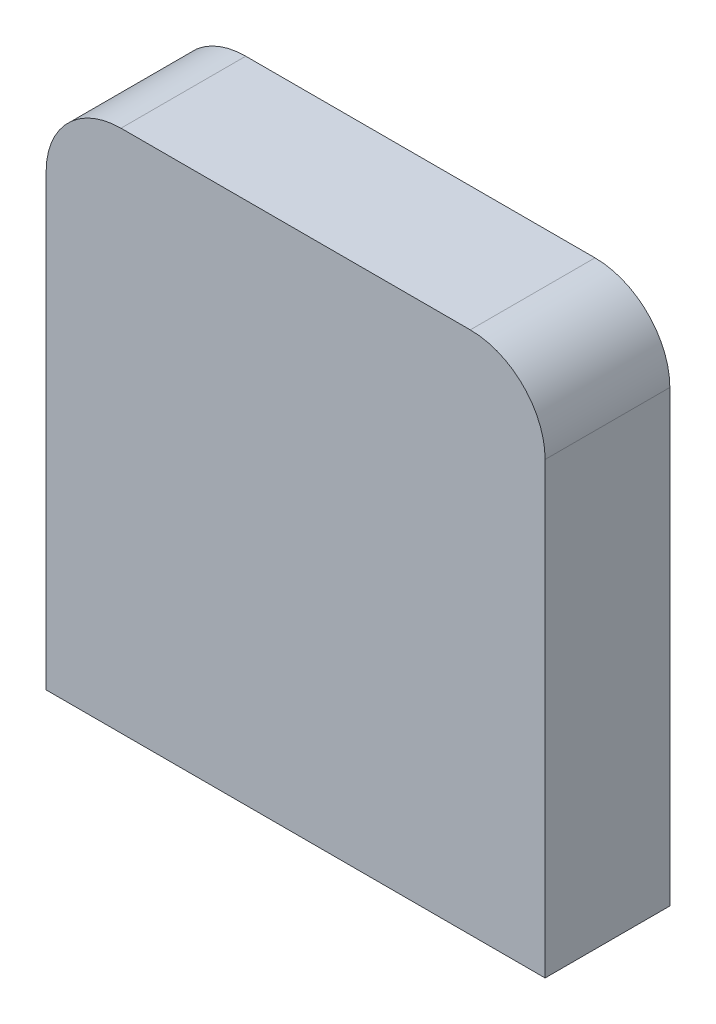
ISO-10303-21;
HEADER;
FILE_DESCRIPTION(('STEP AP214'),'2;1');
FILE_NAME('part.step','',(''),(''),'','','');
FILE_SCHEMA(('AUTOMOTIVE_DESIGN { 1 0 10303 214 1 1 1 1 }'));
ENDSEC;
DATA;
#1=APPLICATION_CONTEXT('core data for automotive mechanical design processes');
#2=APPLICATION_PROTOCOL_DEFINITION('international standard','automotive_design',2000,#1);
#3=PRODUCT_CONTEXT('',#1,'mechanical');
#4=PRODUCT('Part','Part','',(#3));
#5=PRODUCT_RELATED_PRODUCT_CATEGORY('part','',(#4));
#6=PRODUCT_DEFINITION_FORMATION('','',#4);
#7=PRODUCT_DEFINITION_CONTEXT('part definition',#1,'design');
#8=PRODUCT_DEFINITION('design','',#6,#7);
#9=PRODUCT_DEFINITION_SHAPE('','',#8);
#10=(LENGTH_UNIT() NAMED_UNIT(*) SI_UNIT(.MILLI.,.METRE.));
#11=(NAMED_UNIT(*) PLANE_ANGLE_UNIT() SI_UNIT($,.RADIAN.));
#12=(NAMED_UNIT(*) SI_UNIT($,.STERADIAN.) SOLID_ANGLE_UNIT());
#13=UNCERTAINTY_MEASURE_WITH_UNIT(LENGTH_MEASURE(1.E-05),#10,'distance_accuracy_value','');
#14=(GEOMETRIC_REPRESENTATION_CONTEXT(3) GLOBAL_UNCERTAINTY_ASSIGNED_CONTEXT((#13)) GLOBAL_UNIT_ASSIGNED_CONTEXT((#10,
#11,#12)) REPRESENTATION_CONTEXT('',''));
#15=CARTESIAN_POINT('',(0.,0.,0.));
#16=DIRECTION('',(0.,0.,1.));
#17=DIRECTION('',(1.,0.,0.));
#18=AXIS2_PLACEMENT_3D('',#15,#16,#17);
#19=CARTESIAN_POINT('',(10.,7.49999999999998,5.));
#20=DIRECTION('',(-1.,0.,0.));
#21=DIRECTION('',(0.,-1.,0.));
#22=AXIS2_PLACEMENT_3D('',#19,#20,#21);
#23=PLANE('',#22);
#24=DIRECTION('',(0.,1.,0.));
#25=VECTOR('',#24,1.);
#26=CARTESIAN_POINT('',(10.,7.49999999999998,0.));
#27=LINE('',#26,#25);
#28=CARTESIAN_POINT('',(10.,-10.5,0.));
#29=VERTEX_POINT('',#28);
#30=CARTESIAN_POINT('',(10.,7.49999999999998,0.));
#31=VERTEX_POINT('',#30);
#32=EDGE_CURVE('E117',#29,#31,#27,.T.);
#33=ORIENTED_EDGE('',*,*,#32,.T.);
#34=DIRECTION('',(0.,0.,-1.));
#35=VECTOR('',#34,1.);
#36=CARTESIAN_POINT('',(10.,7.49999999999998,5.));
#37=LINE('',#36,#35);
#38=CARTESIAN_POINT('',(10.,7.49999999999998,5.));
#39=VERTEX_POINT('',#38);
#40=EDGE_CURVE('E11',#39,#31,#37,.T.);
#41=ORIENTED_EDGE('',*,*,#40,.F.);
#42=DIRECTION('',(0.,1.,0.));
#43=VECTOR('',#42,1.);
#44=CARTESIAN_POINT('',(10.,7.49999999999998,5.));
#45=LINE('',#44,#43);
#46=CARTESIAN_POINT('',(10.,-10.5,5.));
#47=VERTEX_POINT('',#46);
#48=EDGE_CURVE('E127',#47,#39,#45,.T.);
#49=ORIENTED_EDGE('',*,*,#48,.F.);
#50=DIRECTION('',(0.,0.,-1.));
#51=VECTOR('',#50,1.);
#52=CARTESIAN_POINT('',(10.,-10.5,5.));
#53=LINE('',#52,#51);
#54=EDGE_CURVE('E113',#47,#29,#53,.T.);
#55=ORIENTED_EDGE('',*,*,#54,.T.);
#56=EDGE_LOOP('',(#33,#41,#49,#55));
#57=FACE_BOUND('',#56,.T.);
#58=ADVANCED_FACE('F33',(#57),#23,.F.);
#59=CARTESIAN_POINT('',(7.,7.5,5.));
#60=DIRECTION('',(0.,0.,-1.));
#61=DIRECTION('',(-1.,0.,0.));
#62=AXIS2_PLACEMENT_3D('',#59,#60,#61);
#63=CYLINDRICAL_SURFACE('',#62,3.);
#64=CARTESIAN_POINT('',(7.,7.5,0.));
#65=DIRECTION('',(0.,0.,1.));
#66=DIRECTION('',(-1.,0.,0.));
#67=AXIS2_PLACEMENT_3D('',#64,#65,#66);
#68=CIRCLE('',#67,3.);
#69=CARTESIAN_POINT('',(6.99999999999998,10.5,0.));
#70=VERTEX_POINT('',#69);
#71=EDGE_CURVE('E120',#31,#70,#68,.T.);
#72=ORIENTED_EDGE('',*,*,#71,.T.);
#73=DIRECTION('',(0.,0.,-1.));
#74=VECTOR('',#73,1.);
#75=CARTESIAN_POINT('',(6.99999999999998,10.5,5.));
#76=LINE('',#75,#74);
#77=CARTESIAN_POINT('',(6.99999999999998,10.5,5.));
#78=VERTEX_POINT('',#77);
#79=EDGE_CURVE('E41',#78,#70,#76,.T.);
#80=ORIENTED_EDGE('',*,*,#79,.F.);
#81=CARTESIAN_POINT('',(7.,7.5,5.));
#82=DIRECTION('',(0.,0.,1.));
#83=DIRECTION('',(-1.,0.,0.));
#84=AXIS2_PLACEMENT_3D('',#81,#82,#83);
#85=CIRCLE('',#84,3.);
#86=EDGE_CURVE('E86',#39,#78,#85,.T.);
#87=ORIENTED_EDGE('',*,*,#86,.F.);
#88=ORIENTED_EDGE('',*,*,#40,.T.);
#89=EDGE_LOOP('',(#72,#80,#87,#88));
#90=FACE_BOUND('',#89,.T.);
#91=ADVANCED_FACE('F151',(#90),#63,.T.);
#92=CARTESIAN_POINT('',(-6.99999999999998,10.5,5.));
#93=DIRECTION('',(0.,-1.,0.));
#94=DIRECTION('',(0.,0.,-1.));
#95=AXIS2_PLACEMENT_3D('',#92,#93,#94);
#96=PLANE('',#95);
#97=DIRECTION('',(-1.,0.,0.));
#98=VECTOR('',#97,1.);
#99=CARTESIAN_POINT('',(-6.99999999999998,10.5,0.));
#100=LINE('',#99,#98);
#101=CARTESIAN_POINT('',(-6.99999999999998,10.5,0.));
#102=VERTEX_POINT('',#101);
#103=EDGE_CURVE('E122',#70,#102,#100,.T.);
#104=ORIENTED_EDGE('',*,*,#103,.T.);
#105=DIRECTION('',(0.,0.,-1.));
#106=VECTOR('',#105,1.);
#107=CARTESIAN_POINT('',(-6.99999999999998,10.5,5.));
#108=LINE('',#107,#106);
#109=CARTESIAN_POINT('',(-6.99999999999998,10.5,5.));
#110=VERTEX_POINT('',#109);
#111=EDGE_CURVE('E108',#110,#102,#108,.T.);
#112=ORIENTED_EDGE('',*,*,#111,.F.);
#113=DIRECTION('',(-1.,0.,0.));
#114=VECTOR('',#113,1.);
#115=CARTESIAN_POINT('',(-6.99999999999998,10.5,5.));
#116=LINE('',#115,#114);
#117=EDGE_CURVE('E99',#78,#110,#116,.T.);
#118=ORIENTED_EDGE('',*,*,#117,.F.);
#119=ORIENTED_EDGE('',*,*,#79,.T.);
#120=EDGE_LOOP('',(#104,#112,#118,#119));
#121=FACE_BOUND('',#120,.T.);
#122=ADVANCED_FACE('F133',(#121),#96,.F.);
#123=CARTESIAN_POINT('',(-7.,7.5,5.));
#124=DIRECTION('',(0.,0.,-1.));
#125=DIRECTION('',(-1.,0.,0.));
#126=AXIS2_PLACEMENT_3D('',#123,#124,#125);
#127=CYLINDRICAL_SURFACE('',#126,3.);
#128=CARTESIAN_POINT('',(-7.,7.5,0.));
#129=DIRECTION('',(0.,0.,1.));
#130=DIRECTION('',(1.,0.,0.));
#131=AXIS2_PLACEMENT_3D('',#128,#129,#130);
#132=CIRCLE('',#131,3.);
#133=CARTESIAN_POINT('',(-10.,7.49999999999998,0.));
#134=VERTEX_POINT('',#133);
#135=EDGE_CURVE('E107',#102,#134,#132,.T.);
#136=ORIENTED_EDGE('',*,*,#135,.T.);
#137=DIRECTION('',(0.,0.,-1.));
#138=VECTOR('',#137,1.);
#139=CARTESIAN_POINT('',(-10.,7.49999999999998,5.));
#140=LINE('',#139,#138);
#141=CARTESIAN_POINT('',(-10.,7.49999999999998,5.));
#142=VERTEX_POINT('',#141);
#143=EDGE_CURVE('E104',#142,#134,#140,.T.);
#144=ORIENTED_EDGE('',*,*,#143,.F.);
#145=CARTESIAN_POINT('',(-7.,7.5,5.));
#146=DIRECTION('',(0.,0.,1.));
#147=DIRECTION('',(1.,0.,0.));
#148=AXIS2_PLACEMENT_3D('',#145,#146,#147);
#149=CIRCLE('',#148,3.);
#150=EDGE_CURVE('E93',#110,#142,#149,.T.);
#151=ORIENTED_EDGE('',*,*,#150,.F.);
#152=ORIENTED_EDGE('',*,*,#111,.T.);
#153=EDGE_LOOP('',(#136,#144,#151,#152));
#154=FACE_BOUND('',#153,.T.);
#155=ADVANCED_FACE('F105',(#154),#127,.T.);
#156=CARTESIAN_POINT('',(-10.,7.49999999999998,5.));
#157=DIRECTION('',(1.,0.,0.));
#158=DIRECTION('',(0.,1.,0.));
#159=AXIS2_PLACEMENT_3D('',#156,#157,#158);
#160=PLANE('',#159);
#161=DIRECTION('',(0.,-1.,0.));
#162=VECTOR('',#161,1.);
#163=CARTESIAN_POINT('',(-10.,7.49999999999998,0.));
#164=LINE('',#163,#162);
#165=CARTESIAN_POINT('',(-10.,-10.5,0.));
#166=VERTEX_POINT('',#165);
#167=EDGE_CURVE('E72',#134,#166,#164,.T.);
#168=ORIENTED_EDGE('',*,*,#167,.T.);
#169=DIRECTION('',(0.,0.,-1.));
#170=VECTOR('',#169,1.);
#171=CARTESIAN_POINT('',(-10.,-10.5,5.));
#172=LINE('',#171,#170);
#173=CARTESIAN_POINT('',(-10.,-10.5,5.));
#174=VERTEX_POINT('',#173);
#175=EDGE_CURVE('E109',#174,#166,#172,.T.);
#176=ORIENTED_EDGE('',*,*,#175,.F.);
#177=DIRECTION('',(0.,-1.,0.));
#178=VECTOR('',#177,1.);
#179=CARTESIAN_POINT('',(-10.,7.49999999999998,5.));
#180=LINE('',#179,#178);
#181=EDGE_CURVE('E97',#142,#174,#180,.T.);
#182=ORIENTED_EDGE('',*,*,#181,.F.);
#183=ORIENTED_EDGE('',*,*,#143,.T.);
#184=EDGE_LOOP('',(#168,#176,#182,#183));
#185=FACE_BOUND('',#184,.T.);
#186=ADVANCED_FACE('F111',(#185),#160,.F.);
#187=CARTESIAN_POINT('',(-10.,-10.5,5.));
#188=DIRECTION('',(0.,1.,0.));
#189=DIRECTION('',(0.,0.,1.));
#190=AXIS2_PLACEMENT_3D('',#187,#188,#189);
#191=PLANE('',#190);
#192=DIRECTION('',(1.,0.,0.));
#193=VECTOR('',#192,1.);
#194=CARTESIAN_POINT('',(-10.,-10.5,0.));
#195=LINE('',#194,#193);
#196=EDGE_CURVE('E78',#166,#29,#195,.T.);
#197=ORIENTED_EDGE('',*,*,#196,.T.);
#198=ORIENTED_EDGE('',*,*,#54,.F.);
#199=DIRECTION('',(1.,0.,0.));
#200=VECTOR('',#199,1.);
#201=CARTESIAN_POINT('',(-10.,-10.5,5.));
#202=LINE('',#201,#200);
#203=EDGE_CURVE('E49',#174,#47,#202,.T.);
#204=ORIENTED_EDGE('',*,*,#203,.F.);
#205=ORIENTED_EDGE('',*,*,#175,.T.);
#206=EDGE_LOOP('',(#197,#198,#204,#205));
#207=FACE_BOUND('',#206,.T.);
#208=ADVANCED_FACE('F140',(#207),#191,.F.);
#209=CARTESIAN_POINT('',(-7.,7.5,5.));
#210=DIRECTION('',(0.,0.,1.));
#211=DIRECTION('',(1.,0.,0.));
#212=AXIS2_PLACEMENT_3D('',#209,#210,#211);
#213=PLANE('',#212);
#214=ORIENTED_EDGE('',*,*,#48,.T.);
#215=ORIENTED_EDGE('',*,*,#86,.T.);
#216=ORIENTED_EDGE('',*,*,#117,.T.);
#217=ORIENTED_EDGE('',*,*,#150,.T.);
#218=ORIENTED_EDGE('',*,*,#181,.T.);
#219=ORIENTED_EDGE('',*,*,#203,.T.);
#220=EDGE_LOOP('',(#214,#215,#216,#217,#218,#219));
#221=FACE_BOUND('',#220,.T.);
#222=ADVANCED_FACE('F95',(#221),#213,.T.);
#223=CARTESIAN_POINT('',(-7.,7.5,0.));
#224=DIRECTION('',(0.,0.,1.));
#225=DIRECTION('',(1.,0.,0.));
#226=AXIS2_PLACEMENT_3D('',#223,#224,#225);
#227=PLANE('',#226);
#228=ORIENTED_EDGE('',*,*,#32,.F.);
#229=ORIENTED_EDGE('',*,*,#196,.F.);
#230=ORIENTED_EDGE('',*,*,#167,.F.);
#231=ORIENTED_EDGE('',*,*,#135,.F.);
#232=ORIENTED_EDGE('',*,*,#103,.F.);
#233=ORIENTED_EDGE('',*,*,#71,.F.);
#234=EDGE_LOOP('',(#228,#229,#230,#231,#232,#233));
#235=FACE_BOUND('',#234,.T.);
#236=ADVANCED_FACE('F136',(#235),#227,.F.);
#237=CLOSED_SHELL('',(#58,#91,#122,#155,#186,#208,#222,#236));
#238=MANIFOLD_SOLID_BREP('B2',#237);
#239=ADVANCED_BREP_SHAPE_REPRESENTATION('',(#18,#238),#14);
#240=SHAPE_DEFINITION_REPRESENTATION(#9,#239);
ENDSEC;
END-ISO-10303-21;
